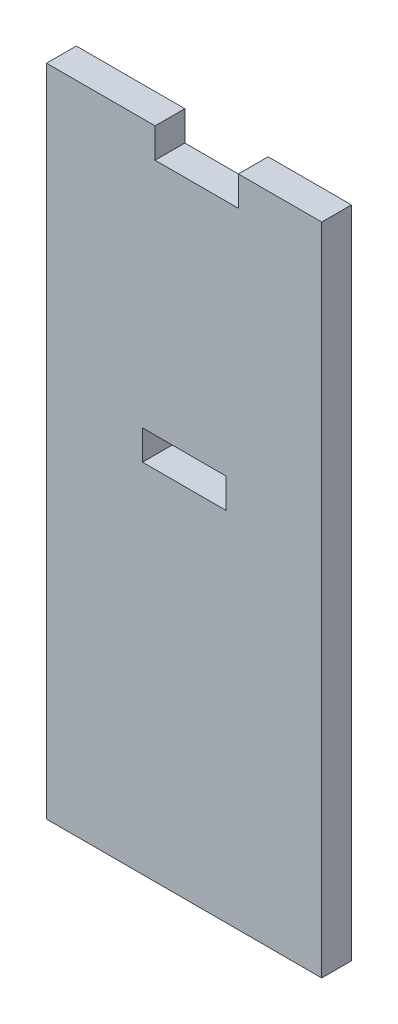
ISO-10303-21;
HEADER;
FILE_DESCRIPTION(('STEP AP214'),'2;1');
FILE_NAME('part.step','',(''),(''),'','','');
FILE_SCHEMA(('AUTOMOTIVE_DESIGN { 1 0 10303 214 1 1 1 1 }'));
ENDSEC;
DATA;
#1=APPLICATION_CONTEXT('core data for automotive mechanical design processes');
#2=APPLICATION_PROTOCOL_DEFINITION('international standard','automotive_design',2000,#1);
#3=PRODUCT_CONTEXT('',#1,'mechanical');
#4=PRODUCT('Part','Part','',(#3));
#5=PRODUCT_RELATED_PRODUCT_CATEGORY('part','',(#4));
#6=PRODUCT_DEFINITION_FORMATION('','',#4);
#7=PRODUCT_DEFINITION_CONTEXT('part definition',#1,'design');
#8=PRODUCT_DEFINITION('design','',#6,#7);
#9=PRODUCT_DEFINITION_SHAPE('','',#8);
#10=(LENGTH_UNIT() NAMED_UNIT(*) SI_UNIT(.MILLI.,.METRE.));
#11=(NAMED_UNIT(*) PLANE_ANGLE_UNIT() SI_UNIT($,.RADIAN.));
#12=(NAMED_UNIT(*) SI_UNIT($,.STERADIAN.) SOLID_ANGLE_UNIT());
#13=UNCERTAINTY_MEASURE_WITH_UNIT(LENGTH_MEASURE(1.E-05),#10,'distance_accuracy_value','');
#14=(GEOMETRIC_REPRESENTATION_CONTEXT(3) GLOBAL_UNCERTAINTY_ASSIGNED_CONTEXT((#13)) GLOBAL_UNIT_ASSIGNED_CONTEXT((#10,
#11,#12)) REPRESENTATION_CONTEXT('',''));
#15=CARTESIAN_POINT('',(0.,0.,0.));
#16=DIRECTION('',(0.,0.,1.));
#17=DIRECTION('',(1.,0.,0.));
#18=AXIS2_PLACEMENT_3D('',#15,#16,#17);
#19=CARTESIAN_POINT('',(0.,0.,2.5));
#20=DIRECTION('',(0.,0.,1.));
#21=DIRECTION('',(1.,0.,0.));
#22=AXIS2_PLACEMENT_3D('',#19,#20,#21);
#23=PLANE('',#22);
#24=DIRECTION('',(0.,1.,0.));
#25=VECTOR('',#24,1.);
#26=CARTESIAN_POINT('',(11.56,-25.,2.5));
#27=LINE('',#26,#25);
#28=CARTESIAN_POINT('',(11.56,-25.,2.5));
#29=VERTEX_POINT('',#28);
#30=CARTESIAN_POINT('',(11.56,30.,2.5));
#31=VERTEX_POINT('',#30);
#32=EDGE_CURVE('E158',#29,#31,#27,.T.);
#33=ORIENTED_EDGE('',*,*,#32,.T.);
#34=DIRECTION('',(-1.,0.,0.));
#35=VECTOR('',#34,1.);
#36=CARTESIAN_POINT('',(11.56,30.,2.5));
#37=LINE('',#36,#35);
#38=CARTESIAN_POINT('',(4.56,30.,2.5));
#39=VERTEX_POINT('',#38);
#40=EDGE_CURVE('E161',#31,#39,#37,.T.);
#41=ORIENTED_EDGE('',*,*,#40,.T.);
#42=DIRECTION('',(0.,-1.,0.));
#43=VECTOR('',#42,1.);
#44=CARTESIAN_POINT('',(4.56,30.,2.5));
#45=LINE('',#44,#43);
#46=CARTESIAN_POINT('',(4.56,27.5,2.5));
#47=VERTEX_POINT('',#46);
#48=EDGE_CURVE('E164',#39,#47,#45,.T.);
#49=ORIENTED_EDGE('',*,*,#48,.T.);
#50=DIRECTION('',(-1.,0.,0.));
#51=VECTOR('',#50,1.);
#52=CARTESIAN_POINT('',(4.56,27.5,2.5));
#53=LINE('',#52,#51);
#54=CARTESIAN_POINT('',(-2.44,27.5,2.5));
#55=VERTEX_POINT('',#54);
#56=EDGE_CURVE('E166',#47,#55,#53,.T.);
#57=ORIENTED_EDGE('',*,*,#56,.T.);
#58=DIRECTION('',(0.,1.,0.));
#59=VECTOR('',#58,1.);
#60=CARTESIAN_POINT('',(-2.44,27.5,2.5));
#61=LINE('',#60,#59);
#62=CARTESIAN_POINT('',(-2.44,30.,2.5));
#63=VERTEX_POINT('',#62);
#64=EDGE_CURVE('E168',#55,#63,#61,.T.);
#65=ORIENTED_EDGE('',*,*,#64,.T.);
#66=DIRECTION('',(-1.,0.,0.));
#67=VECTOR('',#66,1.);
#68=CARTESIAN_POINT('',(-2.44,30.,2.5));
#69=LINE('',#68,#67);
#70=CARTESIAN_POINT('',(-11.56,30.,2.5));
#71=VERTEX_POINT('',#70);
#72=EDGE_CURVE('E170',#63,#71,#69,.T.);
#73=ORIENTED_EDGE('',*,*,#72,.T.);
#74=DIRECTION('',(0.,-1.,0.));
#75=VECTOR('',#74,1.);
#76=CARTESIAN_POINT('',(-11.56,30.,2.5));
#77=LINE('',#76,#75);
#78=CARTESIAN_POINT('',(-11.56,-25.,2.5));
#79=VERTEX_POINT('',#78);
#80=EDGE_CURVE('E172',#71,#79,#77,.T.);
#81=ORIENTED_EDGE('',*,*,#80,.T.);
#82=DIRECTION('',(1.,0.,0.));
#83=VECTOR('',#82,1.);
#84=CARTESIAN_POINT('',(-11.56,-25.,2.5));
#85=LINE('',#84,#83);
#86=EDGE_CURVE('E174',#79,#29,#85,.T.);
#87=ORIENTED_EDGE('',*,*,#86,.T.);
#88=EDGE_LOOP('',(#33,#41,#49,#57,#65,#73,#81,#87));
#89=FACE_BOUND('',#88,.T.);
#90=DIRECTION('',(-1.,0.,0.));
#91=VECTOR('',#90,1.);
#92=CARTESIAN_POINT('',(-3.5,7.50000000000001,2.5));
#93=LINE('',#92,#91);
#94=CARTESIAN_POINT('',(3.5,7.50000000000001,2.5));
#95=VERTEX_POINT('',#94);
#96=CARTESIAN_POINT('',(-3.5,7.50000000000001,2.5));
#97=VERTEX_POINT('',#96);
#98=EDGE_CURVE('E130',#95,#97,#93,.T.);
#99=ORIENTED_EDGE('',*,*,#98,.F.);
#100=DIRECTION('',(0.,1.,0.));
#101=VECTOR('',#100,1.);
#102=CARTESIAN_POINT('',(3.5,5.00000000000001,2.5));
#103=LINE('',#102,#101);
#104=CARTESIAN_POINT('',(3.5,5.00000000000001,2.5));
#105=VERTEX_POINT('',#104);
#106=EDGE_CURVE('E122',#105,#95,#103,.T.);
#107=ORIENTED_EDGE('',*,*,#106,.F.);
#108=DIRECTION('',(1.,0.,0.));
#109=VECTOR('',#108,1.);
#110=CARTESIAN_POINT('',(-3.5,5.00000000000001,2.5));
#111=LINE('',#110,#109);
#112=CARTESIAN_POINT('',(-3.5,5.00000000000001,2.5));
#113=VERTEX_POINT('',#112);
#114=EDGE_CURVE('E144',#113,#105,#111,.T.);
#115=ORIENTED_EDGE('',*,*,#114,.F.);
#116=DIRECTION('',(0.,-1.,0.));
#117=VECTOR('',#116,1.);
#118=CARTESIAN_POINT('',(-3.5,5.00000000000001,2.5));
#119=LINE('',#118,#117);
#120=EDGE_CURVE('E142',#97,#113,#119,.T.);
#121=ORIENTED_EDGE('',*,*,#120,.F.);
#122=EDGE_LOOP('',(#99,#107,#115,#121));
#123=FACE_BOUND('',#122,.T.);
#124=ADVANCED_FACE('F33',(#89,#123),#23,.T.);
#125=CARTESIAN_POINT('',(0.,0.,0.));
#126=DIRECTION('',(0.,0.,1.));
#127=DIRECTION('',(1.,0.,0.));
#128=AXIS2_PLACEMENT_3D('',#125,#126,#127);
#129=PLANE('',#128);
#130=DIRECTION('',(0.,1.,0.));
#131=VECTOR('',#130,1.);
#132=CARTESIAN_POINT('',(11.56,-25.,0.));
#133=LINE('',#132,#131);
#134=CARTESIAN_POINT('',(11.56,-25.,0.));
#135=VERTEX_POINT('',#134);
#136=CARTESIAN_POINT('',(11.56,30.,0.));
#137=VERTEX_POINT('',#136);
#138=EDGE_CURVE('E138',#135,#137,#133,.T.);
#139=ORIENTED_EDGE('',*,*,#138,.F.);
#140=DIRECTION('',(1.,0.,0.));
#141=VECTOR('',#140,1.);
#142=CARTESIAN_POINT('',(-11.56,-25.,0.));
#143=LINE('',#142,#141);
#144=CARTESIAN_POINT('',(-11.56,-25.,0.));
#145=VERTEX_POINT('',#144);
#146=EDGE_CURVE('E162',#145,#135,#143,.T.);
#147=ORIENTED_EDGE('',*,*,#146,.F.);
#148=DIRECTION('',(0.,-1.,0.));
#149=VECTOR('',#148,1.);
#150=CARTESIAN_POINT('',(-11.56,30.,0.));
#151=LINE('',#150,#149);
#152=CARTESIAN_POINT('',(-11.56,30.,0.));
#153=VERTEX_POINT('',#152);
#154=EDGE_CURVE('E189',#153,#145,#151,.T.);
#155=ORIENTED_EDGE('',*,*,#154,.F.);
#156=DIRECTION('',(-1.,0.,0.));
#157=VECTOR('',#156,1.);
#158=CARTESIAN_POINT('',(-2.44,30.,0.));
#159=LINE('',#158,#157);
#160=CARTESIAN_POINT('',(-2.44,30.,0.));
#161=VERTEX_POINT('',#160);
#162=EDGE_CURVE('E187',#161,#153,#159,.T.);
#163=ORIENTED_EDGE('',*,*,#162,.F.);
#164=DIRECTION('',(0.,1.,0.));
#165=VECTOR('',#164,1.);
#166=CARTESIAN_POINT('',(-2.44,27.5,0.));
#167=LINE('',#166,#165);
#168=CARTESIAN_POINT('',(-2.44,27.5,0.));
#169=VERTEX_POINT('',#168);
#170=EDGE_CURVE('E185',#169,#161,#167,.T.);
#171=ORIENTED_EDGE('',*,*,#170,.F.);
#172=DIRECTION('',(-1.,0.,0.));
#173=VECTOR('',#172,1.);
#174=CARTESIAN_POINT('',(4.56,27.5,0.));
#175=LINE('',#174,#173);
#176=CARTESIAN_POINT('',(4.56,27.5,0.));
#177=VERTEX_POINT('',#176);
#178=EDGE_CURVE('E183',#177,#169,#175,.T.);
#179=ORIENTED_EDGE('',*,*,#178,.F.);
#180=DIRECTION('',(0.,-1.,0.));
#181=VECTOR('',#180,1.);
#182=CARTESIAN_POINT('',(4.56,30.,0.));
#183=LINE('',#182,#181);
#184=CARTESIAN_POINT('',(4.56,30.,0.));
#185=VERTEX_POINT('',#184);
#186=EDGE_CURVE('E181',#185,#177,#183,.T.);
#187=ORIENTED_EDGE('',*,*,#186,.F.);
#188=DIRECTION('',(-1.,0.,0.));
#189=VECTOR('',#188,1.);
#190=CARTESIAN_POINT('',(11.56,30.,0.));
#191=LINE('',#190,#189);
#192=EDGE_CURVE('E179',#137,#185,#191,.T.);
#193=ORIENTED_EDGE('',*,*,#192,.F.);
#194=EDGE_LOOP('',(#139,#147,#155,#163,#171,#179,#187,#193));
#195=FACE_BOUND('',#194,.T.);
#196=DIRECTION('',(0.,1.,0.));
#197=VECTOR('',#196,1.);
#198=CARTESIAN_POINT('',(3.5,5.00000000000001,0.));
#199=LINE('',#198,#197);
#200=CARTESIAN_POINT('',(3.5,5.00000000000001,0.));
#201=VERTEX_POINT('',#200);
#202=CARTESIAN_POINT('',(3.5,7.50000000000001,0.));
#203=VERTEX_POINT('',#202);
#204=EDGE_CURVE('E56',#201,#203,#199,.T.);
#205=ORIENTED_EDGE('',*,*,#204,.T.);
#206=DIRECTION('',(-1.,0.,0.));
#207=VECTOR('',#206,1.);
#208=CARTESIAN_POINT('',(-3.5,7.50000000000001,0.));
#209=LINE('',#208,#207);
#210=CARTESIAN_POINT('',(-3.5,7.50000000000001,0.));
#211=VERTEX_POINT('',#210);
#212=EDGE_CURVE('E137',#203,#211,#209,.T.);
#213=ORIENTED_EDGE('',*,*,#212,.T.);
#214=DIRECTION('',(0.,-1.,0.));
#215=VECTOR('',#214,1.);
#216=CARTESIAN_POINT('',(-3.5,5.00000000000001,0.));
#217=LINE('',#216,#215);
#218=CARTESIAN_POINT('',(-3.5,5.00000000000001,0.));
#219=VERTEX_POINT('',#218);
#220=EDGE_CURVE('E150',#211,#219,#217,.T.);
#221=ORIENTED_EDGE('',*,*,#220,.T.);
#222=DIRECTION('',(1.,0.,0.));
#223=VECTOR('',#222,1.);
#224=CARTESIAN_POINT('',(-3.5,5.00000000000001,0.));
#225=LINE('',#224,#223);
#226=EDGE_CURVE('E131',#219,#201,#225,.T.);
#227=ORIENTED_EDGE('',*,*,#226,.T.);
#228=EDGE_LOOP('',(#205,#213,#221,#227));
#229=FACE_BOUND('',#228,.T.);
#230=ADVANCED_FACE('F219',(#195,#229),#129,.F.);
#231=CARTESIAN_POINT('',(11.56,-25.,2.5));
#232=DIRECTION('',(-1.,0.,0.));
#233=DIRECTION('',(0.,0.,1.));
#234=AXIS2_PLACEMENT_3D('',#231,#232,#233);
#235=PLANE('',#234);
#236=ORIENTED_EDGE('',*,*,#138,.T.);
#237=DIRECTION('',(0.,0.,-1.));
#238=VECTOR('',#237,1.);
#239=CARTESIAN_POINT('',(11.56,30.,2.5));
#240=LINE('',#239,#238);
#241=EDGE_CURVE('E11',#31,#137,#240,.T.);
#242=ORIENTED_EDGE('',*,*,#241,.F.);
#243=ORIENTED_EDGE('',*,*,#32,.F.);
#244=DIRECTION('',(0.,0.,-1.));
#245=VECTOR('',#244,1.);
#246=CARTESIAN_POINT('',(11.56,-25.,2.5));
#247=LINE('',#246,#245);
#248=EDGE_CURVE('E176',#29,#135,#247,.T.);
#249=ORIENTED_EDGE('',*,*,#248,.T.);
#250=EDGE_LOOP('',(#236,#242,#243,#249));
#251=FACE_BOUND('',#250,.T.);
#252=ADVANCED_FACE('F35',(#251),#235,.F.);
#253=CARTESIAN_POINT('',(11.56,30.,2.5));
#254=DIRECTION('',(0.,-1.,0.));
#255=DIRECTION('',(0.,0.,-1.));
#256=AXIS2_PLACEMENT_3D('',#253,#254,#255);
#257=PLANE('',#256);
#258=ORIENTED_EDGE('',*,*,#192,.T.);
#259=DIRECTION('',(0.,0.,-1.));
#260=VECTOR('',#259,1.);
#261=CARTESIAN_POINT('',(4.56,30.,2.5));
#262=LINE('',#261,#260);
#263=EDGE_CURVE('E41',#39,#185,#262,.T.);
#264=ORIENTED_EDGE('',*,*,#263,.F.);
#265=ORIENTED_EDGE('',*,*,#40,.F.);
#266=ORIENTED_EDGE('',*,*,#241,.T.);
#267=EDGE_LOOP('',(#258,#264,#265,#266));
#268=FACE_BOUND('',#267,.T.);
#269=ADVANCED_FACE('F236',(#268),#257,.F.);
#270=CARTESIAN_POINT('',(4.56,30.,2.5));
#271=DIRECTION('',(1.,0.,0.));
#272=DIRECTION('',(0.,0.,-1.));
#273=AXIS2_PLACEMENT_3D('',#270,#271,#272);
#274=PLANE('',#273);
#275=ORIENTED_EDGE('',*,*,#186,.T.);
#276=DIRECTION('',(0.,0.,-1.));
#277=VECTOR('',#276,1.);
#278=CARTESIAN_POINT('',(4.56,27.5,2.5));
#279=LINE('',#278,#277);
#280=EDGE_CURVE('E206',#47,#177,#279,.T.);
#281=ORIENTED_EDGE('',*,*,#280,.F.);
#282=ORIENTED_EDGE('',*,*,#48,.F.);
#283=ORIENTED_EDGE('',*,*,#263,.T.);
#284=EDGE_LOOP('',(#275,#281,#282,#283));
#285=FACE_BOUND('',#284,.T.);
#286=ADVANCED_FACE('F213',(#285),#274,.F.);
#287=CARTESIAN_POINT('',(4.56,27.5,2.5));
#288=DIRECTION('',(0.,-1.,0.));
#289=DIRECTION('',(0.,0.,-1.));
#290=AXIS2_PLACEMENT_3D('',#287,#288,#289);
#291=PLANE('',#290);
#292=ORIENTED_EDGE('',*,*,#178,.T.);
#293=DIRECTION('',(0.,0.,-1.));
#294=VECTOR('',#293,1.);
#295=CARTESIAN_POINT('',(-2.44,27.5,2.5));
#296=LINE('',#295,#294);
#297=EDGE_CURVE('E203',#55,#169,#296,.T.);
#298=ORIENTED_EDGE('',*,*,#297,.F.);
#299=ORIENTED_EDGE('',*,*,#56,.F.);
#300=ORIENTED_EDGE('',*,*,#280,.T.);
#301=EDGE_LOOP('',(#292,#298,#299,#300));
#302=FACE_BOUND('',#301,.T.);
#303=ADVANCED_FACE('F225',(#302),#291,.F.);
#304=CARTESIAN_POINT('',(-2.44,27.5,2.5));
#305=DIRECTION('',(-1.,0.,0.));
#306=DIRECTION('',(0.,0.,1.));
#307=AXIS2_PLACEMENT_3D('',#304,#305,#306);
#308=PLANE('',#307);
#309=ORIENTED_EDGE('',*,*,#170,.T.);
#310=DIRECTION('',(0.,0.,-1.));
#311=VECTOR('',#310,1.);
#312=CARTESIAN_POINT('',(-2.44,30.,2.5));
#313=LINE('',#312,#311);
#314=EDGE_CURVE('E200',#63,#161,#313,.T.);
#315=ORIENTED_EDGE('',*,*,#314,.F.);
#316=ORIENTED_EDGE('',*,*,#64,.F.);
#317=ORIENTED_EDGE('',*,*,#297,.T.);
#318=EDGE_LOOP('',(#309,#315,#316,#317));
#319=FACE_BOUND('',#318,.T.);
#320=ADVANCED_FACE('F229',(#319),#308,.F.);
#321=CARTESIAN_POINT('',(-2.44,30.,2.5));
#322=DIRECTION('',(0.,-1.,0.));
#323=DIRECTION('',(0.,0.,-1.));
#324=AXIS2_PLACEMENT_3D('',#321,#322,#323);
#325=PLANE('',#324);
#326=ORIENTED_EDGE('',*,*,#162,.T.);
#327=DIRECTION('',(0.,0.,-1.));
#328=VECTOR('',#327,1.);
#329=CARTESIAN_POINT('',(-11.56,30.,2.5));
#330=LINE('',#329,#328);
#331=EDGE_CURVE('E197',#71,#153,#330,.T.);
#332=ORIENTED_EDGE('',*,*,#331,.F.);
#333=ORIENTED_EDGE('',*,*,#72,.F.);
#334=ORIENTED_EDGE('',*,*,#314,.T.);
#335=EDGE_LOOP('',(#326,#332,#333,#334));
#336=FACE_BOUND('',#335,.T.);
#337=ADVANCED_FACE('F249',(#336),#325,.F.);
#338=CARTESIAN_POINT('',(-11.56,30.,2.5));
#339=DIRECTION('',(1.,0.,0.));
#340=DIRECTION('',(0.,0.,-1.));
#341=AXIS2_PLACEMENT_3D('',#338,#339,#340);
#342=PLANE('',#341);
#343=ORIENTED_EDGE('',*,*,#154,.T.);
#344=DIRECTION('',(0.,0.,-1.));
#345=VECTOR('',#344,1.);
#346=CARTESIAN_POINT('',(-11.56,-25.,2.5));
#347=LINE('',#346,#345);
#348=EDGE_CURVE('E194',#79,#145,#347,.T.);
#349=ORIENTED_EDGE('',*,*,#348,.F.);
#350=ORIENTED_EDGE('',*,*,#80,.F.);
#351=ORIENTED_EDGE('',*,*,#331,.T.);
#352=EDGE_LOOP('',(#343,#349,#350,#351));
#353=FACE_BOUND('',#352,.T.);
#354=ADVANCED_FACE('F247',(#353),#342,.F.);
#355=CARTESIAN_POINT('',(-11.56,-25.,2.5));
#356=DIRECTION('',(0.,1.,0.));
#357=DIRECTION('',(0.,0.,1.));
#358=AXIS2_PLACEMENT_3D('',#355,#356,#357);
#359=PLANE('',#358);
#360=ORIENTED_EDGE('',*,*,#146,.T.);
#361=ORIENTED_EDGE('',*,*,#248,.F.);
#362=ORIENTED_EDGE('',*,*,#86,.F.);
#363=ORIENTED_EDGE('',*,*,#348,.T.);
#364=EDGE_LOOP('',(#360,#361,#362,#363));
#365=FACE_BOUND('',#364,.T.);
#366=ADVANCED_FACE('F242',(#365),#359,.F.);
#367=CARTESIAN_POINT('',(3.5,5.00000000000001,2.5));
#368=DIRECTION('',(-1.,0.,0.));
#369=DIRECTION('',(0.,0.,1.));
#370=AXIS2_PLACEMENT_3D('',#367,#368,#369);
#371=PLANE('',#370);
#372=ORIENTED_EDGE('',*,*,#204,.F.);
#373=DIRECTION('',(0.,0.,-1.));
#374=VECTOR('',#373,1.);
#375=CARTESIAN_POINT('',(3.5,5.00000000000001,2.5));
#376=LINE('',#375,#374);
#377=EDGE_CURVE('E126',#105,#201,#376,.T.);
#378=ORIENTED_EDGE('',*,*,#377,.F.);
#379=ORIENTED_EDGE('',*,*,#106,.T.);
#380=DIRECTION('',(0.,0.,-1.));
#381=VECTOR('',#380,1.);
#382=CARTESIAN_POINT('',(3.5,7.50000000000001,2.5));
#383=LINE('',#382,#381);
#384=EDGE_CURVE('E125',#95,#203,#383,.T.);
#385=ORIENTED_EDGE('',*,*,#384,.T.);
#386=EDGE_LOOP('',(#372,#378,#379,#385));
#387=FACE_BOUND('',#386,.T.);
#388=ADVANCED_FACE('F124',(#387),#371,.T.);
#389=CARTESIAN_POINT('',(-3.5,7.50000000000001,2.5));
#390=DIRECTION('',(0.,-1.,0.));
#391=DIRECTION('',(0.,0.,-1.));
#392=AXIS2_PLACEMENT_3D('',#389,#390,#391);
#393=PLANE('',#392);
#394=ORIENTED_EDGE('',*,*,#212,.F.);
#395=ORIENTED_EDGE('',*,*,#384,.F.);
#396=ORIENTED_EDGE('',*,*,#98,.T.);
#397=DIRECTION('',(0.,0.,-1.));
#398=VECTOR('',#397,1.);
#399=CARTESIAN_POINT('',(-3.5,7.50000000000001,2.5));
#400=LINE('',#399,#398);
#401=EDGE_CURVE('E139',#97,#211,#400,.T.);
#402=ORIENTED_EDGE('',*,*,#401,.T.);
#403=EDGE_LOOP('',(#394,#395,#396,#402));
#404=FACE_BOUND('',#403,.T.);
#405=ADVANCED_FACE('F134',(#404),#393,.T.);
#406=CARTESIAN_POINT('',(-3.5,5.00000000000001,2.5));
#407=DIRECTION('',(1.,0.,0.));
#408=DIRECTION('',(0.,0.,-1.));
#409=AXIS2_PLACEMENT_3D('',#406,#407,#408);
#410=PLANE('',#409);
#411=ORIENTED_EDGE('',*,*,#220,.F.);
#412=ORIENTED_EDGE('',*,*,#401,.F.);
#413=ORIENTED_EDGE('',*,*,#120,.T.);
#414=DIRECTION('',(0.,0.,-1.));
#415=VECTOR('',#414,1.);
#416=CARTESIAN_POINT('',(-3.5,5.00000000000001,2.5));
#417=LINE('',#416,#415);
#418=EDGE_CURVE('E48',#113,#219,#417,.T.);
#419=ORIENTED_EDGE('',*,*,#418,.T.);
#420=EDGE_LOOP('',(#411,#412,#413,#419));
#421=FACE_BOUND('',#420,.T.);
#422=ADVANCED_FACE('F274',(#421),#410,.T.);
#423=CARTESIAN_POINT('',(-3.5,5.00000000000001,2.5));
#424=DIRECTION('',(0.,1.,0.));
#425=DIRECTION('',(0.,0.,1.));
#426=AXIS2_PLACEMENT_3D('',#423,#424,#425);
#427=PLANE('',#426);
#428=ORIENTED_EDGE('',*,*,#226,.F.);
#429=ORIENTED_EDGE('',*,*,#418,.F.);
#430=ORIENTED_EDGE('',*,*,#114,.T.);
#431=ORIENTED_EDGE('',*,*,#377,.T.);
#432=EDGE_LOOP('',(#428,#429,#430,#431));
#433=FACE_BOUND('',#432,.T.);
#434=ADVANCED_FACE('F278',(#433),#427,.T.);
#435=CLOSED_SHELL('',(#124,#230,#252,#269,#286,#303,#320,#337,#354,#366,#388,#405,#422,#434));
#436=MANIFOLD_SOLID_BREP('B2',#435);
#437=ADVANCED_BREP_SHAPE_REPRESENTATION('',(#18,#436),#14);
#438=SHAPE_DEFINITION_REPRESENTATION(#9,#437);
ENDSEC;
END-ISO-10303-21;
